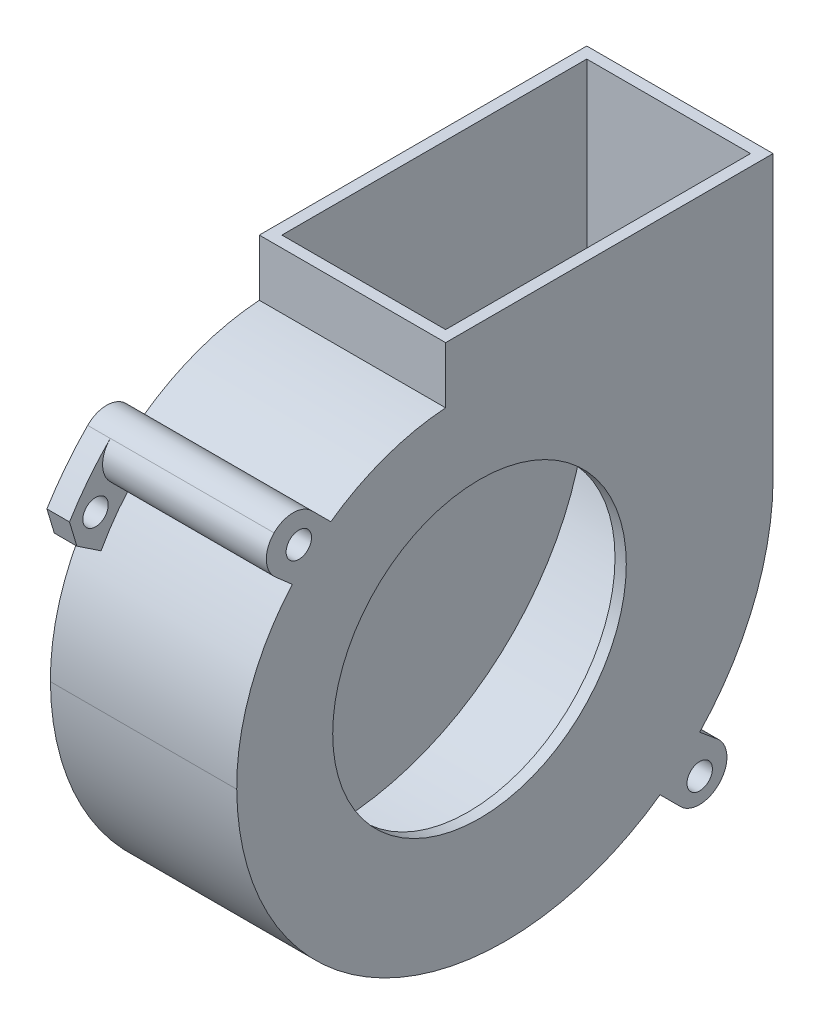
ISO-10303-21;
HEADER;
FILE_DESCRIPTION(('STEP AP214'),'2;1');
FILE_NAME('part.step','',(''),(''),'','','');
FILE_SCHEMA(('AUTOMOTIVE_DESIGN { 1 0 10303 214 1 1 1 1 }'));
ENDSEC;
DATA;
#1=APPLICATION_CONTEXT('core data for automotive mechanical design processes');
#2=APPLICATION_PROTOCOL_DEFINITION('international standard','automotive_design',2000,#1);
#3=PRODUCT_CONTEXT('',#1,'mechanical');
#4=PRODUCT('Part','Part','',(#3));
#5=PRODUCT_RELATED_PRODUCT_CATEGORY('part','',(#4));
#6=PRODUCT_DEFINITION_FORMATION('','',#4);
#7=PRODUCT_DEFINITION_CONTEXT('part definition',#1,'design');
#8=PRODUCT_DEFINITION('design','',#6,#7);
#9=PRODUCT_DEFINITION_SHAPE('','',#8);
#10=(LENGTH_UNIT() NAMED_UNIT(*) SI_UNIT(.MILLI.,.METRE.));
#11=(NAMED_UNIT(*) PLANE_ANGLE_UNIT() SI_UNIT($,.RADIAN.));
#12=(NAMED_UNIT(*) SI_UNIT($,.STERADIAN.) SOLID_ANGLE_UNIT());
#13=UNCERTAINTY_MEASURE_WITH_UNIT(LENGTH_MEASURE(1.E-05),#10,'distance_accuracy_value','');
#14=(GEOMETRIC_REPRESENTATION_CONTEXT(3) GLOBAL_UNCERTAINTY_ASSIGNED_CONTEXT((#13)) GLOBAL_UNIT_ASSIGNED_CONTEXT((#10,
#11,#12)) REPRESENTATION_CONTEXT('',''));
#15=CARTESIAN_POINT('',(0.,0.,0.));
#16=DIRECTION('',(0.,0.,1.));
#17=DIRECTION('',(1.,0.,0.));
#18=AXIS2_PLACEMENT_3D('',#15,#16,#17);
#19=CARTESIAN_POINT('',(33.,0.401698513800419,-4.49999999999999));
#20=DIRECTION('',(-1.,0.,0.));
#21=DIRECTION('',(0.,0.,1.));
#22=AXIS2_PLACEMENT_3D('',#19,#20,#21);
#23=CYLINDRICAL_SURFACE('',#22,47.5016985138004);
#24=DIRECTION('',(-1.,0.,0.));
#25=VECTOR('',#24,1.);
#26=CARTESIAN_POINT('',(33.,-32.2504279360342,-39.));
#27=LINE('',#26,#25);
#28=CARTESIAN_POINT('',(33.,-32.2504279360342,-39.));
#29=VERTEX_POINT('',#28);
#30=CARTESIAN_POINT('',(4.,-32.2504279360342,-39.));
#31=VERTEX_POINT('',#30);
#32=EDGE_CURVE('E249',#29,#31,#27,.T.);
#33=ORIENTED_EDGE('',*,*,#32,.T.);
#34=CARTESIAN_POINT('',(4.,0.401698513800419,-4.49999999999999));
#35=DIRECTION('',(-1.,0.,0.));
#36=DIRECTION('',(0.,0.,1.));
#37=AXIS2_PLACEMENT_3D('',#34,#35,#36);
#38=CIRCLE('',#37,47.5016985138004);
#39=CARTESIAN_POINT('',(4.,-25.2685357241009,-44.4681177423615));
#40=VERTEX_POINT('',#39);
#41=EDGE_CURVE('E259',#40,#31,#38,.T.);
#42=ORIENTED_EDGE('',*,*,#41,.F.);
#43=DIRECTION('',(-1.,0.,0.));
#44=VECTOR('',#43,1.);
#45=CARTESIAN_POINT('',(4.,-25.2685357241009,-44.4681177423615));
#46=LINE('',#45,#44);
#47=CARTESIAN_POINT('',(0.,-25.2685357241009,-44.4681177423615));
#48=VERTEX_POINT('',#47);
#49=EDGE_CURVE('E325',#40,#48,#46,.T.);
#50=ORIENTED_EDGE('',*,*,#49,.T.);
#51=CARTESIAN_POINT('',(0.,0.401698513800419,-4.49999999999999));
#52=DIRECTION('',(1.,0.,0.));
#53=DIRECTION('',(0.,0.,1.));
#54=AXIS2_PLACEMENT_3D('',#51,#52,#53);
#55=CIRCLE('',#54,47.5016985138004);
#56=CARTESIAN_POINT('',(0.,0.,-52.));
#57=VERTEX_POINT('',#56);
#58=EDGE_CURVE('E403',#48,#57,#55,.T.);
#59=ORIENTED_EDGE('',*,*,#58,.T.);
#60=DIRECTION('',(-1.,0.,0.));
#61=VECTOR('',#60,1.);
#62=CARTESIAN_POINT('',(33.,0.,-52.));
#63=LINE('',#62,#61);
#64=CARTESIAN_POINT('',(33.,0.,-52.));
#65=VERTEX_POINT('',#64);
#66=EDGE_CURVE('E455',#65,#57,#63,.T.);
#67=ORIENTED_EDGE('',*,*,#66,.F.);
#68=CARTESIAN_POINT('',(33.,0.401698513800419,-4.49999999999999));
#69=DIRECTION('',(1.,0.,0.));
#70=DIRECTION('',(0.,0.,1.));
#71=AXIS2_PLACEMENT_3D('',#68,#69,#70);
#72=CIRCLE('',#71,47.5016985138004);
#73=EDGE_CURVE('E271',#29,#65,#72,.T.);
#74=ORIENTED_EDGE('',*,*,#73,.F.);
#75=EDGE_LOOP('',(#33,#42,#50,#59,#67,#74));
#76=FACE_BOUND('',#75,.T.);
#77=ADVANCED_FACE('F50',(#76),#23,.T.);
#78=DIRECTION('',(-1.,0.,0.));
#79=VECTOR('',#78,1.);
#80=CARTESIAN_POINT('',(33.,-38.3442234179757,-31.9802637424152));
#81=LINE('',#80,#79);
#82=CARTESIAN_POINT('',(33.,-38.3442234179757,-31.9802637424152));
#83=VERTEX_POINT('',#82);
#84=CARTESIAN_POINT('',(0.,-38.3442234179757,-31.9802637424152));
#85=VERTEX_POINT('',#84);
#86=EDGE_CURVE('E274',#83,#85,#81,.T.);
#87=ORIENTED_EDGE('',*,*,#86,.F.);
#88=CARTESIAN_POINT('',(33.,0.,43.));
#89=VERTEX_POINT('',#88);
#90=EDGE_CURVE('E404',#89,#83,#72,.T.);
#91=ORIENTED_EDGE('',*,*,#90,.F.);
#92=DIRECTION('',(-1.,0.,0.));
#93=VECTOR('',#92,1.);
#94=CARTESIAN_POINT('',(33.,0.,43.));
#95=LINE('',#94,#93);
#96=CARTESIAN_POINT('',(0.,0.,43.));
#97=VERTEX_POINT('',#96);
#98=EDGE_CURVE('E422',#89,#97,#95,.T.);
#99=ORIENTED_EDGE('',*,*,#98,.T.);
#100=EDGE_CURVE('E423',#97,#85,#55,.T.);
#101=ORIENTED_EDGE('',*,*,#100,.T.);
#102=EDGE_LOOP('',(#87,#91,#99,#101));
#103=FACE_BOUND('',#102,.T.);
#104=ADVANCED_FACE('F645',(#103),#23,.T.);
#105=CARTESIAN_POINT('',(33.,0.336227008902246,3.2418670366511));
#106=DIRECTION('',(-1.,0.,0.));
#107=DIRECTION('',(0.,0.,1.));
#108=AXIS2_PLACEMENT_3D('',#105,#106,#107);
#109=CYLINDRICAL_SURFACE('',#108,39.7595546420335);
#110=DIRECTION('',(-1.,0.,0.));
#111=VECTOR('',#110,1.);
#112=CARTESIAN_POINT('',(33.,32.7006095169495,26.3366484862697));
#113=LINE('',#112,#111);
#114=CARTESIAN_POINT('',(33.,32.7006095169497,26.3366484862695));
#115=VERTEX_POINT('',#114);
#116=CARTESIAN_POINT('',(0.,32.7006095169497,26.3366484862695));
#117=VERTEX_POINT('',#116);
#118=EDGE_CURVE('E299',#115,#117,#113,.T.);
#119=ORIENTED_EDGE('',*,*,#118,.F.);
#120=CARTESIAN_POINT('',(33.,0.336227008902246,3.2418670366511));
#121=DIRECTION('',(1.,0.,0.));
#122=DIRECTION('',(0.,0.,1.));
#123=AXIS2_PLACEMENT_3D('',#120,#121,#122);
#124=CIRCLE('',#123,39.7595546420335);
#125=CARTESIAN_POINT('',(33.,40.,6.));
#126=VERTEX_POINT('',#125);
#127=EDGE_CURVE('E418',#126,#115,#124,.T.);
#128=ORIENTED_EDGE('',*,*,#127,.F.);
#129=DIRECTION('',(-1.,0.,0.));
#130=VECTOR('',#129,1.);
#131=CARTESIAN_POINT('',(33.,40.,6.));
#132=LINE('',#131,#130);
#133=CARTESIAN_POINT('',(0.,40.,6.));
#134=VERTEX_POINT('',#133);
#135=EDGE_CURVE('E443',#126,#134,#132,.T.);
#136=ORIENTED_EDGE('',*,*,#135,.T.);
#137=CARTESIAN_POINT('',(0.,0.336227008902246,3.2418670366511));
#138=DIRECTION('',(1.,0.,0.));
#139=DIRECTION('',(0.,0.,1.));
#140=AXIS2_PLACEMENT_3D('',#137,#138,#139);
#141=CIRCLE('',#140,39.7595546420335);
#142=EDGE_CURVE('E437',#134,#117,#141,.T.);
#143=ORIENTED_EDGE('',*,*,#142,.T.);
#144=EDGE_LOOP('',(#119,#128,#136,#143));
#145=FACE_BOUND('',#144,.T.);
#146=ADVANCED_FACE('F651',(#145),#109,.T.);
#147=DIRECTION('',(-1.,0.,0.));
#148=VECTOR('',#147,1.);
#149=CARTESIAN_POINT('',(33.,26.5124468861732,33.1689066207732));
#150=LINE('',#149,#148);
#151=CARTESIAN_POINT('',(33.,26.5124468861732,33.1689066207732));
#152=VERTEX_POINT('',#151);
#153=CARTESIAN_POINT('',(4.,26.5124468861732,33.1689066207732));
#154=VERTEX_POINT('',#153);
#155=EDGE_CURVE('E307',#152,#154,#150,.T.);
#156=ORIENTED_EDGE('',*,*,#155,.T.);
#157=CARTESIAN_POINT('',(4.,0.336227008902246,3.2418670366511));
#158=DIRECTION('',(-1.,0.,0.));
#159=DIRECTION('',(0.,0.,1.));
#160=AXIS2_PLACEMENT_3D('',#157,#158,#159);
#161=CIRCLE('',#160,39.7595546420335);
#162=CARTESIAN_POINT('',(4.,19.5852482227505,38.0311953952393));
#163=VERTEX_POINT('',#162);
#164=EDGE_CURVE('E343',#163,#154,#161,.T.);
#165=ORIENTED_EDGE('',*,*,#164,.F.);
#166=DIRECTION('',(-1.,0.,0.));
#167=VECTOR('',#166,1.);
#168=CARTESIAN_POINT('',(4.,19.5852482227505,38.0311953952393));
#169=LINE('',#168,#167);
#170=CARTESIAN_POINT('',(0.,19.5852482227505,38.0311953952393));
#171=VERTEX_POINT('',#170);
#172=EDGE_CURVE('E330',#163,#171,#169,.T.);
#173=ORIENTED_EDGE('',*,*,#172,.T.);
#174=EDGE_CURVE('E436',#171,#97,#141,.T.);
#175=ORIENTED_EDGE('',*,*,#174,.T.);
#176=ORIENTED_EDGE('',*,*,#98,.F.);
#177=EDGE_CURVE('E417',#152,#89,#124,.T.);
#178=ORIENTED_EDGE('',*,*,#177,.F.);
#179=EDGE_LOOP('',(#156,#165,#173,#175,#176,#178));
#180=FACE_BOUND('',#179,.T.);
#181=ADVANCED_FACE('F592',(#180),#109,.T.);
#182=CARTESIAN_POINT('',(4.,0.,0.));
#183=DIRECTION('',(-1.,0.,0.));
#184=DIRECTION('',(0.,0.,1.));
#185=AXIS2_PLACEMENT_3D('',#182,#183,#184);
#186=PLANE('',#185);
#187=CARTESIAN_POINT('',(4.,26.,39.));
#188=DIRECTION('',(-1.,0.,0.));
#189=DIRECTION('',(0.,0.,1.));
#190=AXIS2_PLACEMENT_3D('',#187,#188,#189);
#191=CIRCLE('',#190,2.25);
#192=CARTESIAN_POINT('',(4.,26.,41.25));
#193=VERTEX_POINT('',#192);
#194=EDGE_CURVE('E352',#193,#193,#191,.T.);
#195=ORIENTED_EDGE('',*,*,#194,.T.);
#196=EDGE_LOOP('',(#195));
#197=FACE_BOUND('',#196,.T.);
#198=DIRECTION('',(0.,-0.65836300514286,-0.752700573574421));
#199=VECTOR('',#198,1.);
#200=CARTESIAN_POINT('',(4.,-1.41601574265621,1.23854346920139));
#201=LINE('',#200,#199);
#202=CARTESIAN_POINT('',(4.,29.1065676427182,36.1347418304067));
#203=VERTEX_POINT('',#202);
#204=EDGE_CURVE('E255',#203,#154,#201,.T.);
#205=ORIENTED_EDGE('',*,*,#204,.F.);
#206=CARTESIAN_POINT('',(4.,32.6818953671967,33.0075175559781));
#207=DIRECTION('',(-1.,0.,0.));
#208=DIRECTION('',(0.,0.,1.));
#209=AXIS2_PLACEMENT_3D('',#206,#207,#208);
#210=CIRCLE('',#209,4.75);
#211=CARTESIAN_POINT('',(4.,36.0162183696367,36.3905325005799));
#212=VERTEX_POINT('',#211);
#213=EDGE_CURVE('E11',#203,#212,#210,.T.);
#214=ORIENTED_EDGE('',*,*,#213,.T.);
#215=CARTESIAN_POINT('',(4.,32.6678575696839,33.021410960276));
#216=DIRECTION('',(-1.,0.,0.));
#217=DIRECTION('',(0.,0.,1.));
#218=AXIS2_PLACEMENT_3D('',#215,#216,#217);
#219=CIRCLE('',#218,4.75);
#220=CARTESIAN_POINT('',(4.,36.0084888604477,36.3981967958259));
#221=VERTEX_POINT('',#220);
#222=EDGE_CURVE('E60',#212,#221,#219,.F.);
#223=ORIENTED_EDGE('',*,*,#222,.T.);
#224=CARTESIAN_POINT('',(4.,0.,0.));
#225=DIRECTION('',(-1.,0.,0.));
#226=DIRECTION('',(0.,0.,1.));
#227=AXIS2_PLACEMENT_3D('',#224,#225,#226);
#228=CIRCLE('',#227,51.2000000000064);
#229=CARTESIAN_POINT('',(4.,26.8102492942381,43.6193825355364));
#230=VERTEX_POINT('',#229);
#231=EDGE_CURVE('E339',#221,#230,#228,.F.);
#232=ORIENTED_EDGE('',*,*,#231,.T.);
#233=DIRECTION('',(0.,0.957876085319527,0.287181832943761));
#234=VECTOR('',#233,1.);
#235=CARTESIAN_POINT('',(4.,22.4365092610887,42.3080869527468));
#236=LINE('',#235,#234);
#237=CARTESIAN_POINT('',(4.,22.4365092610887,42.3080869527468));
#238=VERTEX_POINT('',#237);
#239=EDGE_CURVE('E256',#230,#238,#236,.F.);
#240=ORIENTED_EDGE('',*,*,#239,.T.);
#241=DIRECTION('',(0.,0.554700196225216,0.832050294337853));
#242=VECTOR('',#241,1.);
#243=CARTESIAN_POINT('',(4.,-3.99384141282111,2.66256094188065));
#244=LINE('',#243,#242);
#245=EDGE_CURVE('E348',#163,#238,#244,.T.);
#246=ORIENTED_EDGE('',*,*,#245,.F.);
#247=ORIENTED_EDGE('',*,*,#164,.T.);
#248=EDGE_LOOP('',(#205,#214,#223,#232,#240,#246,#247));
#249=FACE_BOUND('',#248,.T.);
#250=ADVANCED_FACE('F565',(#197,#249),#186,.F.);
#251=CARTESIAN_POINT('',(4.,0.,0.));
#252=DIRECTION('',(-1.,0.,0.));
#253=DIRECTION('',(0.,0.,1.));
#254=AXIS2_PLACEMENT_3D('',#251,#252,#253);
#255=PLANE('',#254);
#256=CARTESIAN_POINT('',(4.,-31.5,-45.));
#257=DIRECTION('',(-1.,0.,0.));
#258=DIRECTION('',(0.,0.,1.));
#259=AXIS2_PLACEMENT_3D('',#256,#257,#258);
#260=CIRCLE('',#259,2.25);
#261=CARTESIAN_POINT('',(4.,-31.5,-42.75));
#262=VERTEX_POINT('',#261);
#263=EDGE_CURVE('E321',#262,#262,#260,.T.);
#264=ORIENTED_EDGE('',*,*,#263,.T.);
#265=EDGE_LOOP('',(#264));
#266=FACE_BOUND('',#265,.T.);
#267=DIRECTION('',(0.,0.639323231191685,0.768938102878654));
#268=VECTOR('',#267,1.);
#269=CARTESIAN_POINT('',(4.,0.103824438897831,-0.0863234316316615));
#270=LINE('',#269,#268);
#271=CARTESIAN_POINT('',(4.,-34.8377339478056,-42.1118502804125));
#272=VERTEX_POINT('',#271);
#273=EDGE_CURVE('E244',#272,#31,#270,.T.);
#274=ORIENTED_EDGE('',*,*,#273,.F.);
#275=CARTESIAN_POINT('',(4.,-38.4901899364793,-39.075064932252));
#276=DIRECTION('',(-1.,0.,0.));
#277=DIRECTION('',(0.,0.,1.));
#278=AXIS2_PLACEMENT_3D('',#275,#276,#277);
#279=CIRCLE('',#278,4.75);
#280=CARTESIAN_POINT('',(4.,-41.8235259278129,-42.4590523980798));
#281=VERTEX_POINT('',#280);
#282=EDGE_CURVE('E560',#272,#281,#279,.T.);
#283=ORIENTED_EDGE('',*,*,#282,.T.);
#284=CARTESIAN_POINT('',(4.,0.,0.));
#285=DIRECTION('',(-1.,0.,0.));
#286=DIRECTION('',(0.,0.,1.));
#287=AXIS2_PLACEMENT_3D('',#284,#285,#286);
#288=CIRCLE('',#287,59.5984769233017);
#289=CARTESIAN_POINT('',(4.,-31.7635758624256,-50.4286991703064));
#290=VERTEX_POINT('',#289);
#291=EDGE_CURVE('E267',#281,#290,#288,.F.);
#292=ORIENTED_EDGE('',*,*,#291,.T.);
#293=CARTESIAN_POINT('',(4.,-30.6976568154237,-48.7364176968988));
#294=DIRECTION('',(-1.,0.,0.));
#295=DIRECTION('',(0.,0.,1.));
#296=AXIS2_PLACEMENT_3D('',#293,#294,#295);
#297=CIRCLE('',#296,2.);
#298=CARTESIAN_POINT('',(4.,-29.0591929743856,-49.8833423856254));
#299=VERTEX_POINT('',#298);
#300=EDGE_CURVE('E504',#290,#299,#297,.F.);
#301=ORIENTED_EDGE('',*,*,#300,.T.);
#302=DIRECTION('',(0.,0.573462344363328,0.819231920519041));
#303=VECTOR('',#302,1.);
#304=CARTESIAN_POINT('',(4.,3.93231321849135,-2.75261925294395));
#305=LINE('',#304,#303);
#306=EDGE_CURVE('E262',#299,#40,#305,.T.);
#307=ORIENTED_EDGE('',*,*,#306,.T.);
#308=ORIENTED_EDGE('',*,*,#41,.T.);
#309=EDGE_LOOP('',(#274,#283,#292,#301,#307,#308));
#310=FACE_BOUND('',#309,.T.);
#311=ADVANCED_FACE('F260',(#266,#310),#255,.F.);
#312=CARTESIAN_POINT('',(33.,0.,0.));
#313=DIRECTION('',(-1.,0.,0.));
#314=DIRECTION('',(0.,0.,1.));
#315=AXIS2_PLACEMENT_3D('',#312,#313,#314);
#316=CYLINDRICAL_SURFACE('',#315,26.);
#317=CARTESIAN_POINT('',(31.,0.,0.));
#318=DIRECTION('',(1.,0.,0.));
#319=DIRECTION('',(0.,0.,-1.));
#320=AXIS2_PLACEMENT_3D('',#317,#318,#319);
#321=CIRCLE('',#320,26.);
#322=CARTESIAN_POINT('',(31.,0.,-26.));
#323=VERTEX_POINT('',#322);
#324=EDGE_CURVE('E395',#323,#323,#321,.T.);
#325=ORIENTED_EDGE('',*,*,#324,.F.);
#326=EDGE_LOOP('',(#325));
#327=FACE_BOUND('',#326,.T.);
#328=CARTESIAN_POINT('',(33.,0.,0.));
#329=DIRECTION('',(1.,0.,0.));
#330=DIRECTION('',(0.,0.,-1.));
#331=AXIS2_PLACEMENT_3D('',#328,#329,#330);
#332=CIRCLE('',#331,26.);
#333=CARTESIAN_POINT('',(33.,0.,-26.));
#334=VERTEX_POINT('',#333);
#335=EDGE_CURVE('E399',#334,#334,#332,.T.);
#336=ORIENTED_EDGE('',*,*,#335,.T.);
#337=EDGE_LOOP('',(#336));
#338=FACE_BOUND('',#337,.T.);
#339=ADVANCED_FACE('F667',(#327,#338),#316,.F.);
#340=CARTESIAN_POINT('',(33.,0.401698513800419,-4.49999999999999));
#341=DIRECTION('',(-1.,0.,0.));
#342=DIRECTION('',(0.,0.,1.));
#343=AXIS2_PLACEMENT_3D('',#340,#341,#342);
#344=CYLINDRICAL_SURFACE('',#343,45.5016985138004);
#345=CARTESIAN_POINT('',(31.,0.401698513800419,-4.49999999999999));
#346=DIRECTION('',(-1.,0.,0.));
#347=DIRECTION('',(0.,0.,1.));
#348=AXIS2_PLACEMENT_3D('',#345,#346,#347);
#349=CIRCLE('',#348,45.5016985138004);
#350=CARTESIAN_POINT('',(31.,0.0169130168549075,41.0000715138133));
#351=VERTEX_POINT('',#350);
#352=CARTESIAN_POINT('',(31.,-2.99999999999988,-49.8743651731018));
#353=VERTEX_POINT('',#352);
#354=EDGE_CURVE('E459',#351,#353,#349,.F.);
#355=ORIENTED_EDGE('',*,*,#354,.T.);
#356=DIRECTION('',(-1.,0.,0.));
#357=VECTOR('',#356,1.);
#358=CARTESIAN_POINT('',(33.,-2.99999999999989,-49.8743651731018));
#359=LINE('',#358,#357);
#360=CARTESIAN_POINT('',(2.,-2.99999999999989,-49.8743651731018));
#361=VERTEX_POINT('',#360);
#362=EDGE_CURVE('E377',#353,#361,#359,.T.);
#363=ORIENTED_EDGE('',*,*,#362,.T.);
#364=CARTESIAN_POINT('',(2.,0.401698513800419,-4.49999999999999));
#365=DIRECTION('',(-1.,0.,0.));
#366=DIRECTION('',(0.,0.,1.));
#367=AXIS2_PLACEMENT_3D('',#364,#365,#366);
#368=CIRCLE('',#367,45.5016985138004);
#369=CARTESIAN_POINT('',(2.,0.0169130168549075,41.0000715138133));
#370=VERTEX_POINT('',#369);
#371=EDGE_CURVE('E478',#370,#361,#368,.F.);
#372=ORIENTED_EDGE('',*,*,#371,.F.);
#373=DIRECTION('',(-1.,0.,0.));
#374=VECTOR('',#373,1.);
#375=CARTESIAN_POINT('',(33.,0.0169130168549075,41.0000715138133));
#376=LINE('',#375,#374);
#377=EDGE_CURVE('E474',#351,#370,#376,.T.);
#378=ORIENTED_EDGE('',*,*,#377,.F.);
#379=EDGE_LOOP('',(#355,#363,#372,#378));
#380=FACE_BOUND('',#379,.T.);
#381=ADVANCED_FACE('F659',(#380),#344,.F.);
#382=CARTESIAN_POINT('',(31.,0.401698513800419,-4.49999999999999));
#383=DIRECTION('',(-1.,0.,0.));
#384=DIRECTION('',(0.,0.,1.));
#385=AXIS2_PLACEMENT_3D('',#382,#383,#384);
#386=PLANE('',#385);
#387=CARTESIAN_POINT('',(31.,0.336227008902246,3.2418670366511));
#388=DIRECTION('',(-1.,0.,0.));
#389=DIRECTION('',(0.,0.,1.));
#390=AXIS2_PLACEMENT_3D('',#387,#388,#389);
#391=CIRCLE('',#390,37.7595546420335);
#392=CARTESIAN_POINT('',(31.,38.0881700208135,4.));
#393=VERTEX_POINT('',#392);
#394=EDGE_CURVE('E482',#393,#351,#391,.F.);
#395=ORIENTED_EDGE('',*,*,#394,.F.);
#396=DIRECTION('',(0.,-1.,0.));
#397=VECTOR('',#396,1.);
#398=CARTESIAN_POINT('',(31.,0.401698513800419,4.));
#399=LINE('',#398,#397);
#400=CARTESIAN_POINT('',(31.,50.,4.));
#401=VERTEX_POINT('',#400);
#402=EDGE_CURVE('E485',#401,#393,#399,.T.);
#403=ORIENTED_EDGE('',*,*,#402,.F.);
#404=DIRECTION('',(0.,0.,-1.));
#405=VECTOR('',#404,1.);
#406=CARTESIAN_POINT('',(31.,50.,4.));
#407=LINE('',#406,#405);
#408=CARTESIAN_POINT('',(31.,50.0000000000001,-50.));
#409=VERTEX_POINT('',#408);
#410=EDGE_CURVE('E338',#401,#409,#407,.T.);
#411=ORIENTED_EDGE('',*,*,#410,.T.);
#412=DIRECTION('',(0.,1.,0.));
#413=VECTOR('',#412,1.);
#414=CARTESIAN_POINT('',(31.,0.401698513800419,-50.));
#415=LINE('',#414,#413);
#416=CARTESIAN_POINT('',(31.,-2.99999999999988,-50.0000000000001));
#417=VERTEX_POINT('',#416);
#418=EDGE_CURVE('E488',#417,#409,#415,.T.);
#419=ORIENTED_EDGE('',*,*,#418,.F.);
#420=DIRECTION('',(0.,0.,-1.));
#421=VECTOR('',#420,1.);
#422=CARTESIAN_POINT('',(31.,-3.00000000000001,3.99999999999988));
#423=LINE('',#422,#421);
#424=EDGE_CURVE('E365',#353,#417,#423,.T.);
#425=ORIENTED_EDGE('',*,*,#424,.F.);
#426=ORIENTED_EDGE('',*,*,#354,.F.);
#427=EDGE_LOOP('',(#395,#403,#411,#419,#425,#426));
#428=FACE_BOUND('',#427,.T.);
#429=ORIENTED_EDGE('',*,*,#324,.T.);
#430=EDGE_LOOP('',(#429));
#431=FACE_BOUND('',#430,.T.);
#432=ADVANCED_FACE('F655',(#428,#431),#386,.T.);
#433=CARTESIAN_POINT('',(2.,0.401698513800419,-4.49999999999999));
#434=DIRECTION('',(-1.,0.,0.));
#435=DIRECTION('',(0.,0.,1.));
#436=AXIS2_PLACEMENT_3D('',#433,#434,#435);
#437=PLANE('',#436);
#438=DIRECTION('',(0.,-1.,0.));
#439=VECTOR('',#438,1.);
#440=CARTESIAN_POINT('',(2.,0.401698513800419,4.));
#441=LINE('',#440,#439);
#442=CARTESIAN_POINT('',(2.,50.,4.));
#443=VERTEX_POINT('',#442);
#444=CARTESIAN_POINT('',(2.,38.0881700208135,4.));
#445=VERTEX_POINT('',#444);
#446=EDGE_CURVE('E468',#443,#445,#441,.T.);
#447=ORIENTED_EDGE('',*,*,#446,.T.);
#448=CARTESIAN_POINT('',(2.,0.336227008902246,3.2418670366511));
#449=DIRECTION('',(-1.,0.,0.));
#450=DIRECTION('',(0.,0.,1.));
#451=AXIS2_PLACEMENT_3D('',#448,#449,#450);
#452=CIRCLE('',#451,37.7595546420335);
#453=EDGE_CURVE('E465',#445,#370,#452,.F.);
#454=ORIENTED_EDGE('',*,*,#453,.T.);
#455=ORIENTED_EDGE('',*,*,#371,.T.);
#456=DIRECTION('',(0.,0.,1.));
#457=VECTOR('',#456,1.);
#458=CARTESIAN_POINT('',(2.,-3.00000000000001,3.99999999999988));
#459=LINE('',#458,#457);
#460=CARTESIAN_POINT('',(2.,-2.99999999999988,-50.0000000000001));
#461=VERTEX_POINT('',#460);
#462=EDGE_CURVE('E374',#461,#361,#459,.T.);
#463=ORIENTED_EDGE('',*,*,#462,.F.);
#464=DIRECTION('',(0.,1.,0.));
#465=VECTOR('',#464,1.);
#466=CARTESIAN_POINT('',(2.,0.401698513800419,-50.));
#467=LINE('',#466,#465);
#468=CARTESIAN_POINT('',(2.,50.0000000000001,-50.));
#469=VERTEX_POINT('',#468);
#470=EDGE_CURVE('E471',#461,#469,#467,.T.);
#471=ORIENTED_EDGE('',*,*,#470,.T.);
#472=DIRECTION('',(0.,0.,1.));
#473=VECTOR('',#472,1.);
#474=CARTESIAN_POINT('',(2.,50.,4.));
#475=LINE('',#474,#473);
#476=EDGE_CURVE('E385',#469,#443,#475,.T.);
#477=ORIENTED_EDGE('',*,*,#476,.T.);
#478=EDGE_LOOP('',(#447,#454,#455,#463,#471,#477));
#479=FACE_BOUND('',#478,.T.);
#480=ADVANCED_FACE('F658',(#479),#437,.F.);
#481=CARTESIAN_POINT('',(33.,0.,-50.));
#482=DIRECTION('',(0.,0.,1.));
#483=DIRECTION('',(1.,0.,0.));
#484=AXIS2_PLACEMENT_3D('',#481,#482,#483);
#485=PLANE('',#484);
#486=ORIENTED_EDGE('',*,*,#470,.F.);
#487=DIRECTION('',(-1.,0.,0.));
#488=VECTOR('',#487,1.);
#489=CARTESIAN_POINT('',(31.,-2.99999999999988,-50.0000000000001));
#490=LINE('',#489,#488);
#491=EDGE_CURVE('E369',#417,#461,#490,.T.);
#492=ORIENTED_EDGE('',*,*,#491,.F.);
#493=ORIENTED_EDGE('',*,*,#418,.T.);
#494=DIRECTION('',(-1.,0.,0.));
#495=VECTOR('',#494,1.);
#496=CARTESIAN_POINT('',(31.,50.0000000000001,-50.));
#497=LINE('',#496,#495);
#498=EDGE_CURVE('E381',#409,#469,#497,.T.);
#499=ORIENTED_EDGE('',*,*,#498,.T.);
#500=EDGE_LOOP('',(#486,#492,#493,#499));
#501=FACE_BOUND('',#500,.T.);
#502=ADVANCED_FACE('F663',(#501),#485,.T.);
#503=CARTESIAN_POINT('',(33.,50.,4.));
#504=DIRECTION('',(0.,0.,-1.));
#505=DIRECTION('',(-1.,0.,0.));
#506=AXIS2_PLACEMENT_3D('',#503,#504,#505);
#507=PLANE('',#506);
#508=ORIENTED_EDGE('',*,*,#446,.F.);
#509=DIRECTION('',(1.,0.,0.));
#510=VECTOR('',#509,1.);
#511=CARTESIAN_POINT('',(31.,50.,4.));
#512=LINE('',#511,#510);
#513=EDGE_CURVE('E370',#443,#401,#512,.T.);
#514=ORIENTED_EDGE('',*,*,#513,.T.);
#515=ORIENTED_EDGE('',*,*,#402,.T.);
#516=DIRECTION('',(-1.,0.,0.));
#517=VECTOR('',#516,1.);
#518=CARTESIAN_POINT('',(31.,38.0881700208135,4.));
#519=LINE('',#518,#517);
#520=EDGE_CURVE('E460',#393,#445,#519,.T.);
#521=ORIENTED_EDGE('',*,*,#520,.T.);
#522=EDGE_LOOP('',(#508,#514,#515,#521));
#523=FACE_BOUND('',#522,.T.);
#524=ADVANCED_FACE('F671',(#523),#507,.T.);
#525=CARTESIAN_POINT('',(33.,0.336227008902246,3.2418670366511));
#526=DIRECTION('',(-1.,0.,0.));
#527=DIRECTION('',(0.,0.,1.));
#528=AXIS2_PLACEMENT_3D('',#525,#526,#527);
#529=CYLINDRICAL_SURFACE('',#528,37.7595546420335);
#530=ORIENTED_EDGE('',*,*,#453,.F.);
#531=ORIENTED_EDGE('',*,*,#520,.F.);
#532=ORIENTED_EDGE('',*,*,#394,.T.);
#533=ORIENTED_EDGE('',*,*,#377,.T.);
#534=EDGE_LOOP('',(#530,#531,#532,#533));
#535=FACE_BOUND('',#534,.T.);
#536=ADVANCED_FACE('F675',(#535),#529,.F.);
#537=CARTESIAN_POINT('',(0.,-3.,0.));
#538=DIRECTION('',(0.,1.,0.));
#539=DIRECTION('',(0.,0.,1.));
#540=AXIS2_PLACEMENT_3D('',#537,#538,#539);
#541=PLANE('',#540);
#542=ORIENTED_EDGE('',*,*,#424,.T.);
#543=ORIENTED_EDGE('',*,*,#491,.T.);
#544=ORIENTED_EDGE('',*,*,#462,.T.);
#545=ORIENTED_EDGE('',*,*,#362,.F.);
#546=EDGE_LOOP('',(#542,#543,#544,#545));
#547=FACE_BOUND('',#546,.T.);
#548=ADVANCED_FACE('F640',(#547),#541,.T.);
#549=CARTESIAN_POINT('',(33.,0.401698513800419,-4.49999999999999));
#550=DIRECTION('',(-1.,0.,0.));
#551=DIRECTION('',(0.,0.,1.));
#552=AXIS2_PLACEMENT_3D('',#549,#550,#551);
#553=PLANE('',#552);
#554=CARTESIAN_POINT('',(33.,0.,0.));
#555=DIRECTION('',(-1.,0.,0.));
#556=DIRECTION('',(0.,0.,1.));
#557=AXIS2_PLACEMENT_3D('',#554,#555,#556);
#558=CIRCLE('',#557,59.5984769233017);
#559=CARTESIAN_POINT('',(33.,-41.9499162612442,-42.3341821375106));
#560=VERTEX_POINT('',#559);
#561=CARTESIAN_POINT('',(33.,-41.8235259278129,-42.4590523980798));
#562=VERTEX_POINT('',#561);
#563=EDGE_CURVE('E604',#560,#562,#558,.F.);
#564=ORIENTED_EDGE('',*,*,#563,.T.);
#565=CARTESIAN_POINT('',(33.,-38.4901899364793,-39.075064932252));
#566=DIRECTION('',(-1.,0.,0.));
#567=DIRECTION('',(0.,0.,1.));
#568=AXIS2_PLACEMENT_3D('',#565,#566,#567);
#569=CIRCLE('',#568,4.75);
#570=CARTESIAN_POINT('',(33.,-34.8377339478056,-42.1118502804125));
#571=VERTEX_POINT('',#570);
#572=EDGE_CURVE('E540',#562,#571,#569,.F.);
#573=ORIENTED_EDGE('',*,*,#572,.T.);
#574=DIRECTION('',(0.,0.639323231191685,0.768938102878654));
#575=VECTOR('',#574,1.);
#576=CARTESIAN_POINT('',(33.,0.103824438897831,-0.0863234316316615));
#577=LINE('',#576,#575);
#578=EDGE_CURVE('E611',#571,#29,#577,.T.);
#579=ORIENTED_EDGE('',*,*,#578,.T.);
#580=ORIENTED_EDGE('',*,*,#73,.T.);
#581=DIRECTION('',(0.,1.,0.));
#582=VECTOR('',#581,1.);
#583=CARTESIAN_POINT('',(33.,0.,-52.));
#584=LINE('',#583,#582);
#585=CARTESIAN_POINT('',(33.,50.,-52.));
#586=VERTEX_POINT('',#585);
#587=EDGE_CURVE('E408',#65,#586,#584,.T.);
#588=ORIENTED_EDGE('',*,*,#587,.T.);
#589=DIRECTION('',(0.,0.,1.));
#590=VECTOR('',#589,1.);
#591=CARTESIAN_POINT('',(33.,50.,-52.));
#592=LINE('',#591,#590);
#593=CARTESIAN_POINT('',(33.,50.,6.));
#594=VERTEX_POINT('',#593);
#595=EDGE_CURVE('E411',#586,#594,#592,.T.);
#596=ORIENTED_EDGE('',*,*,#595,.T.);
#597=DIRECTION('',(0.,-1.,0.));
#598=VECTOR('',#597,1.);
#599=CARTESIAN_POINT('',(33.,50.,6.));
#600=LINE('',#599,#598);
#601=EDGE_CURVE('E414',#594,#126,#600,.T.);
#602=ORIENTED_EDGE('',*,*,#601,.T.);
#603=ORIENTED_EDGE('',*,*,#127,.T.);
#604=DIRECTION('',(0.,0.707106781186546,0.707106781186549));
#605=VECTOR('',#604,1.);
#606=CARTESIAN_POINT('',(33.,3.18198051534014,-3.18198051534013));
#607=LINE('',#606,#605);
#608=CARTESIAN_POINT('',(33.,36.0266147803201,29.6626537496399));
#609=VERTEX_POINT('',#608);
#610=EDGE_CURVE('E287',#115,#609,#607,.T.);
#611=ORIENTED_EDGE('',*,*,#610,.T.);
#612=CARTESIAN_POINT('',(33.,32.6678575696839,33.021410960276));
#613=DIRECTION('',(-1.,0.,0.));
#614=DIRECTION('',(0.,0.,1.));
#615=AXIS2_PLACEMENT_3D('',#612,#613,#614);
#616=CIRCLE('',#615,4.75);
#617=CARTESIAN_POINT('',(33.,36.0162183696367,36.3905325005799));
#618=VERTEX_POINT('',#617);
#619=EDGE_CURVE('E534',#609,#618,#616,.F.);
#620=ORIENTED_EDGE('',*,*,#619,.T.);
#621=CARTESIAN_POINT('',(33.,32.6818953671967,33.0075175559781));
#622=DIRECTION('',(-1.,0.,0.));
#623=DIRECTION('',(0.,0.,1.));
#624=AXIS2_PLACEMENT_3D('',#621,#622,#623);
#625=CIRCLE('',#624,4.75);
#626=CARTESIAN_POINT('',(33.,29.1065676427182,36.1347418304067));
#627=VERTEX_POINT('',#626);
#628=EDGE_CURVE('E531',#618,#627,#625,.F.);
#629=ORIENTED_EDGE('',*,*,#628,.T.);
#630=DIRECTION('',(0.,-0.65836300514286,-0.752700573574421));
#631=VECTOR('',#630,1.);
#632=CARTESIAN_POINT('',(33.,-1.41601574265621,1.23854346920139));
#633=LINE('',#632,#631);
#634=EDGE_CURVE('E291',#627,#152,#633,.T.);
#635=ORIENTED_EDGE('',*,*,#634,.T.);
#636=ORIENTED_EDGE('',*,*,#177,.T.);
#637=ORIENTED_EDGE('',*,*,#90,.T.);
#638=DIRECTION('',(0.,-0.707098469182781,-0.707115093092608));
#639=VECTOR('',#638,1.);
#640=CARTESIAN_POINT('',(33.,-3.18243057391993,3.18235575662441));
#641=LINE('',#640,#639);
#642=CARTESIAN_POINT('',(33.,-41.9653036495799,-35.6014291057427));
#643=VERTEX_POINT('',#642);
#644=EDGE_CURVE('E607',#83,#643,#641,.T.);
#645=ORIENTED_EDGE('',*,*,#644,.T.);
#646=CARTESIAN_POINT('',(33.,-38.60650695739,-38.9601468343609));
#647=DIRECTION('',(-1.,0.,0.));
#648=DIRECTION('',(0.,0.,1.));
#649=AXIS2_PLACEMENT_3D('',#646,#647,#648);
#650=CIRCLE('',#649,4.75);
#651=EDGE_CURVE('E537',#643,#560,#650,.F.);
#652=ORIENTED_EDGE('',*,*,#651,.T.);
#653=EDGE_LOOP('',(#564,#573,#579,#580,#588,#596,#602,#603,#611,#620,#629,#635,#636,#637,#645,#652));
#654=FACE_BOUND('',#653,.T.);
#655=ORIENTED_EDGE('',*,*,#335,.F.);
#656=EDGE_LOOP('',(#655));
#657=FACE_BOUND('',#656,.T.);
#658=CARTESIAN_POINT('',(33.,32.,32.));
#659=DIRECTION('',(-1.,0.,0.));
#660=DIRECTION('',(0.,0.,1.));
#661=AXIS2_PLACEMENT_3D('',#658,#659,#660);
#662=CIRCLE('',#661,2.25);
#663=CARTESIAN_POINT('',(33.,32.,34.25));
#664=VERTEX_POINT('',#663);
#665=EDGE_CURVE('E295',#664,#664,#662,.T.);
#666=ORIENTED_EDGE('',*,*,#665,.T.);
#667=EDGE_LOOP('',(#666));
#668=FACE_BOUND('',#667,.T.);
#669=CARTESIAN_POINT('',(33.,-39.,-39.));
#670=DIRECTION('',(-1.,0.,0.));
#671=DIRECTION('',(0.,0.,1.));
#672=AXIS2_PLACEMENT_3D('',#669,#670,#671);
#673=CIRCLE('',#672,2.25);
#674=CARTESIAN_POINT('',(33.,-39.,-36.75));
#675=VERTEX_POINT('',#674);
#676=EDGE_CURVE('E281',#675,#675,#673,.T.);
#677=ORIENTED_EDGE('',*,*,#676,.T.);
#678=EDGE_LOOP('',(#677));
#679=FACE_BOUND('',#678,.T.);
#680=ADVANCED_FACE('F619',(#654,#657,#668,#679),#553,.F.);
#681=CARTESIAN_POINT('',(0.,0.401698513800419,-4.49999999999999));
#682=DIRECTION('',(-1.,0.,0.));
#683=DIRECTION('',(0.,0.,1.));
#684=AXIS2_PLACEMENT_3D('',#681,#682,#683);
#685=PLANE('',#684);
#686=CARTESIAN_POINT('',(0.,0.,0.));
#687=DIRECTION('',(-1.,0.,0.));
#688=DIRECTION('',(0.,0.,1.));
#689=AXIS2_PLACEMENT_3D('',#686,#687,#688);
#690=CIRCLE('',#689,59.5984769233017);
#691=CARTESIAN_POINT('',(0.,-41.9499162612442,-42.3341821375106));
#692=VERTEX_POINT('',#691);
#693=CARTESIAN_POINT('',(0.,-31.7635758624256,-50.4286991703064));
#694=VERTEX_POINT('',#693);
#695=EDGE_CURVE('E326',#692,#694,#690,.F.);
#696=ORIENTED_EDGE('',*,*,#695,.F.);
#697=CARTESIAN_POINT('',(0.,-38.60650695739,-38.9601468343609));
#698=DIRECTION('',(-1.,0.,0.));
#699=DIRECTION('',(0.,0.,1.));
#700=AXIS2_PLACEMENT_3D('',#697,#698,#699);
#701=CIRCLE('',#700,4.75);
#702=CARTESIAN_POINT('',(0.,-41.9653036495799,-35.6014291057427));
#703=VERTEX_POINT('',#702);
#704=EDGE_CURVE('E546',#692,#703,#701,.T.);
#705=ORIENTED_EDGE('',*,*,#704,.T.);
#706=DIRECTION('',(0.,-0.707098469182781,-0.707115093092608));
#707=VECTOR('',#706,1.);
#708=CARTESIAN_POINT('',(0.,-3.18243057391993,3.18235575662441));
#709=LINE('',#708,#707);
#710=EDGE_CURVE('E311',#85,#703,#709,.T.);
#711=ORIENTED_EDGE('',*,*,#710,.F.);
#712=ORIENTED_EDGE('',*,*,#100,.F.);
#713=ORIENTED_EDGE('',*,*,#174,.F.);
#714=DIRECTION('',(0.,0.554700196225216,0.832050294337853));
#715=VECTOR('',#714,1.);
#716=CARTESIAN_POINT('',(0.,-3.99384141282111,2.66256094188065));
#717=LINE('',#716,#715);
#718=CARTESIAN_POINT('',(0.,22.4365092610887,42.3080869527468));
#719=VERTEX_POINT('',#718);
#720=EDGE_CURVE('E278',#171,#719,#717,.T.);
#721=ORIENTED_EDGE('',*,*,#720,.T.);
#722=DIRECTION('',(0.,-0.957876085319527,-0.287181832943761));
#723=VECTOR('',#722,1.);
#724=CARTESIAN_POINT('',(0.,-10.6571999517958,32.3862273131529));
#725=LINE('',#724,#723);
#726=CARTESIAN_POINT('',(0.,26.8102492942381,43.6193825355364));
#727=VERTEX_POINT('',#726);
#728=EDGE_CURVE('E511',#719,#727,#725,.F.);
#729=ORIENTED_EDGE('',*,*,#728,.T.);
#730=CARTESIAN_POINT('',(0.,0.,0.));
#731=DIRECTION('',(-1.,0.,0.));
#732=DIRECTION('',(0.,0.,1.));
#733=AXIS2_PLACEMENT_3D('',#730,#731,#732);
#734=CIRCLE('',#733,51.2000000000064);
#735=CARTESIAN_POINT('',(0.,36.0084888604477,36.3981967958259));
#736=VERTEX_POINT('',#735);
#737=EDGE_CURVE('E273',#736,#727,#734,.F.);
#738=ORIENTED_EDGE('',*,*,#737,.F.);
#739=CARTESIAN_POINT('',(0.,32.6678575696839,33.021410960276));
#740=DIRECTION('',(-1.,0.,0.));
#741=DIRECTION('',(0.,0.,1.));
#742=AXIS2_PLACEMENT_3D('',#739,#740,#741);
#743=CIRCLE('',#742,4.75);
#744=CARTESIAN_POINT('',(0.,36.0266147803201,29.6626537496399));
#745=VERTEX_POINT('',#744);
#746=EDGE_CURVE('E543',#736,#745,#743,.T.);
#747=ORIENTED_EDGE('',*,*,#746,.T.);
#748=DIRECTION('',(0.,0.707106781186546,0.707106781186549));
#749=VECTOR('',#748,1.);
#750=CARTESIAN_POINT('',(0.,3.18198051534014,-3.18198051534013));
#751=LINE('',#750,#749);
#752=EDGE_CURVE('E300',#117,#745,#751,.T.);
#753=ORIENTED_EDGE('',*,*,#752,.F.);
#754=ORIENTED_EDGE('',*,*,#142,.F.);
#755=DIRECTION('',(0.,-1.,0.));
#756=VECTOR('',#755,1.);
#757=CARTESIAN_POINT('',(0.,50.,6.));
#758=LINE('',#757,#756);
#759=CARTESIAN_POINT('',(0.,50.,6.));
#760=VERTEX_POINT('',#759);
#761=EDGE_CURVE('E433',#760,#134,#758,.T.);
#762=ORIENTED_EDGE('',*,*,#761,.F.);
#763=DIRECTION('',(0.,0.,1.));
#764=VECTOR('',#763,1.);
#765=CARTESIAN_POINT('',(0.,50.,0.));
#766=LINE('',#765,#764);
#767=CARTESIAN_POINT('',(0.,50.,-52.));
#768=VERTEX_POINT('',#767);
#769=EDGE_CURVE('E430',#768,#760,#766,.T.);
#770=ORIENTED_EDGE('',*,*,#769,.F.);
#771=DIRECTION('',(0.,1.,0.));
#772=VECTOR('',#771,1.);
#773=CARTESIAN_POINT('',(0.,0.,-52.));
#774=LINE('',#773,#772);
#775=EDGE_CURVE('E426',#57,#768,#774,.T.);
#776=ORIENTED_EDGE('',*,*,#775,.F.);
#777=ORIENTED_EDGE('',*,*,#58,.F.);
#778=DIRECTION('',(0.,0.573462344363328,0.819231920519041));
#779=VECTOR('',#778,1.);
#780=CARTESIAN_POINT('',(0.,3.93231321849135,-2.75261925294395));
#781=LINE('',#780,#779);
#782=CARTESIAN_POINT('',(0.,-29.0591929743856,-49.8833423856254));
#783=VERTEX_POINT('',#782);
#784=EDGE_CURVE('E329',#783,#48,#781,.T.);
#785=ORIENTED_EDGE('',*,*,#784,.F.);
#786=CARTESIAN_POINT('',(0.,-30.6976568154237,-48.7364176968988));
#787=DIRECTION('',(-1.,0.,0.));
#788=DIRECTION('',(0.,0.,1.));
#789=AXIS2_PLACEMENT_3D('',#786,#787,#788);
#790=CIRCLE('',#789,2.);
#791=EDGE_CURVE('E497',#783,#694,#790,.T.);
#792=ORIENTED_EDGE('',*,*,#791,.T.);
#793=EDGE_LOOP('',(#696,#705,#711,#712,#713,#721,#729,#738,#747,#753,#754,#762,#770,#776,#777,
#785,#792));
#794=FACE_BOUND('',#793,.T.);
#795=CARTESIAN_POINT('',(0.,32.,32.));
#796=DIRECTION('',(-1.,0.,0.));
#797=DIRECTION('',(0.,0.,1.));
#798=AXIS2_PLACEMENT_3D('',#795,#796,#797);
#799=CIRCLE('',#798,2.25);
#800=CARTESIAN_POINT('',(0.,32.,34.25));
#801=VERTEX_POINT('',#800);
#802=EDGE_CURVE('E292',#801,#801,#799,.T.);
#803=ORIENTED_EDGE('',*,*,#802,.F.);
#804=EDGE_LOOP('',(#803));
#805=FACE_BOUND('',#804,.T.);
#806=CARTESIAN_POINT('',(0.,26.,39.));
#807=DIRECTION('',(-1.,0.,0.));
#808=DIRECTION('',(0.,0.,1.));
#809=AXIS2_PLACEMENT_3D('',#806,#807,#808);
#810=CIRCLE('',#809,2.25);
#811=CARTESIAN_POINT('',(0.,26.,41.25));
#812=VERTEX_POINT('',#811);
#813=EDGE_CURVE('E344',#812,#812,#810,.T.);
#814=ORIENTED_EDGE('',*,*,#813,.F.);
#815=EDGE_LOOP('',(#814));
#816=FACE_BOUND('',#815,.T.);
#817=CARTESIAN_POINT('',(0.,-31.5,-45.));
#818=DIRECTION('',(-1.,0.,0.));
#819=DIRECTION('',(0.,0.,1.));
#820=AXIS2_PLACEMENT_3D('',#817,#818,#819);
#821=CIRCLE('',#820,2.25);
#822=CARTESIAN_POINT('',(0.,-31.5,-42.75));
#823=VERTEX_POINT('',#822);
#824=EDGE_CURVE('E317',#823,#823,#821,.T.);
#825=ORIENTED_EDGE('',*,*,#824,.F.);
#826=EDGE_LOOP('',(#825));
#827=FACE_BOUND('',#826,.T.);
#828=CARTESIAN_POINT('',(0.,-39.,-39.));
#829=DIRECTION('',(-1.,0.,0.));
#830=DIRECTION('',(0.,0.,1.));
#831=AXIS2_PLACEMENT_3D('',#828,#829,#830);
#832=CIRCLE('',#831,2.25);
#833=CARTESIAN_POINT('',(0.,-39.,-36.75));
#834=VERTEX_POINT('',#833);
#835=EDGE_CURVE('E284',#834,#834,#832,.T.);
#836=ORIENTED_EDGE('',*,*,#835,.F.);
#837=EDGE_LOOP('',(#836));
#838=FACE_BOUND('',#837,.T.);
#839=ADVANCED_FACE('F579',(#794,#805,#816,#827,#838),#685,.T.);
#840=CARTESIAN_POINT('',(33.,0.,-52.));
#841=DIRECTION('',(0.,0.,1.));
#842=DIRECTION('',(1.,0.,0.));
#843=AXIS2_PLACEMENT_3D('',#840,#841,#842);
#844=PLANE('',#843);
#845=ORIENTED_EDGE('',*,*,#775,.T.);
#846=DIRECTION('',(-1.,0.,0.));
#847=VECTOR('',#846,1.);
#848=CARTESIAN_POINT('',(33.,50.,-52.));
#849=LINE('',#848,#847);
#850=EDGE_CURVE('E451',#586,#768,#849,.T.);
#851=ORIENTED_EDGE('',*,*,#850,.F.);
#852=ORIENTED_EDGE('',*,*,#587,.F.);
#853=ORIENTED_EDGE('',*,*,#66,.T.);
#854=EDGE_LOOP('',(#845,#851,#852,#853));
#855=FACE_BOUND('',#854,.T.);
#856=ADVANCED_FACE('F630',(#855),#844,.F.);
#857=CARTESIAN_POINT('',(33.,50.,0.));
#858=DIRECTION('',(0.,-1.,0.));
#859=DIRECTION('',(0.,0.,-1.));
#860=AXIS2_PLACEMENT_3D('',#857,#858,#859);
#861=PLANE('',#860);
#862=ORIENTED_EDGE('',*,*,#498,.F.);
#863=ORIENTED_EDGE('',*,*,#410,.F.);
#864=ORIENTED_EDGE('',*,*,#513,.F.);
#865=ORIENTED_EDGE('',*,*,#476,.F.);
#866=EDGE_LOOP('',(#862,#863,#864,#865));
#867=FACE_BOUND('',#866,.T.);
#868=ORIENTED_EDGE('',*,*,#769,.T.);
#869=DIRECTION('',(-1.,0.,0.));
#870=VECTOR('',#869,1.);
#871=CARTESIAN_POINT('',(33.,50.,6.));
#872=LINE('',#871,#870);
#873=EDGE_CURVE('E447',#594,#760,#872,.T.);
#874=ORIENTED_EDGE('',*,*,#873,.F.);
#875=ORIENTED_EDGE('',*,*,#595,.F.);
#876=ORIENTED_EDGE('',*,*,#850,.T.);
#877=EDGE_LOOP('',(#868,#874,#875,#876));
#878=FACE_BOUND('',#877,.T.);
#879=ADVANCED_FACE('F637',(#867,#878),#861,.F.);
#880=CARTESIAN_POINT('',(33.,50.,6.));
#881=DIRECTION('',(0.,0.,-1.));
#882=DIRECTION('',(-1.,0.,0.));
#883=AXIS2_PLACEMENT_3D('',#880,#881,#882);
#884=PLANE('',#883);
#885=ORIENTED_EDGE('',*,*,#761,.T.);
#886=ORIENTED_EDGE('',*,*,#135,.F.);
#887=ORIENTED_EDGE('',*,*,#601,.F.);
#888=ORIENTED_EDGE('',*,*,#873,.T.);
#889=EDGE_LOOP('',(#885,#886,#887,#888));
#890=FACE_BOUND('',#889,.T.);
#891=ADVANCED_FACE('F762',(#890),#884,.F.);
#892=CARTESIAN_POINT('',(4.,0.,0.));
#893=DIRECTION('',(-1.,0.,0.));
#894=DIRECTION('',(0.,0.,1.));
#895=AXIS2_PLACEMENT_3D('',#892,#893,#894);
#896=CYLINDRICAL_SURFACE('',#895,51.2000000000064);
#897=ORIENTED_EDGE('',*,*,#231,.F.);
#898=DIRECTION('',(-1.,0.,0.));
#899=VECTOR('',#898,1.);
#900=CARTESIAN_POINT('',(4.,36.0084888604477,36.3981967958259));
#901=LINE('',#900,#899);
#902=EDGE_CURVE('E552',#221,#736,#901,.T.);
#903=ORIENTED_EDGE('',*,*,#902,.T.);
#904=ORIENTED_EDGE('',*,*,#737,.T.);
#905=DIRECTION('',(-1.,0.,0.));
#906=VECTOR('',#905,1.);
#907=CARTESIAN_POINT('',(4.,26.8102492942381,43.6193825355364));
#908=LINE('',#907,#906);
#909=EDGE_CURVE('E515',#727,#230,#908,.F.);
#910=ORIENTED_EDGE('',*,*,#909,.T.);
#911=EDGE_LOOP('',(#897,#903,#904,#910));
#912=FACE_BOUND('',#911,.T.);
#913=ADVANCED_FACE('F576',(#912),#896,.T.);
#914=CARTESIAN_POINT('',(4.,-3.99384141282111,2.66256094188065));
#915=DIRECTION('',(0.,-0.832050294337853,0.554700196225216));
#916=DIRECTION('',(0.,-0.554700196225216,-0.832050294337853));
#917=AXIS2_PLACEMENT_3D('',#914,#915,#916);
#918=PLANE('',#917);
#919=ORIENTED_EDGE('',*,*,#245,.T.);
#920=DIRECTION('',(-1.,0.,0.));
#921=VECTOR('',#920,1.);
#922=CARTESIAN_POINT('',(0.,22.4365092610887,42.3080869527468));
#923=LINE('',#922,#921);
#924=EDGE_CURVE('E507',#238,#719,#923,.T.);
#925=ORIENTED_EDGE('',*,*,#924,.T.);
#926=ORIENTED_EDGE('',*,*,#720,.F.);
#927=ORIENTED_EDGE('',*,*,#172,.F.);
#928=EDGE_LOOP('',(#919,#925,#926,#927));
#929=FACE_BOUND('',#928,.T.);
#930=ADVANCED_FACE('F590',(#929),#918,.T.);
#931=CARTESIAN_POINT('',(4.,26.,39.));
#932=DIRECTION('',(-1.,0.,0.));
#933=DIRECTION('',(0.,0.,1.));
#934=AXIS2_PLACEMENT_3D('',#931,#932,#933);
#935=CYLINDRICAL_SURFACE('',#934,2.25);
#936=ORIENTED_EDGE('',*,*,#194,.F.);
#937=EDGE_LOOP('',(#936));
#938=FACE_BOUND('',#937,.T.);
#939=ORIENTED_EDGE('',*,*,#813,.T.);
#940=EDGE_LOOP('',(#939));
#941=FACE_BOUND('',#940,.T.);
#942=ADVANCED_FACE('F754',(#938,#941),#935,.F.);
#943=CARTESIAN_POINT('',(4.,0.,0.));
#944=DIRECTION('',(-1.,0.,0.));
#945=DIRECTION('',(0.,0.,1.));
#946=AXIS2_PLACEMENT_3D('',#943,#944,#945);
#947=CYLINDRICAL_SURFACE('',#946,59.5984769233017);
#948=ORIENTED_EDGE('',*,*,#291,.F.);
#949=DIRECTION('',(-1.,0.,0.));
#950=VECTOR('',#949,1.);
#951=CARTESIAN_POINT('',(4.,-41.8235259278129,-42.4590523980798));
#952=LINE('',#951,#950);
#953=EDGE_CURVE('E528',#281,#562,#952,.F.);
#954=ORIENTED_EDGE('',*,*,#953,.T.);
#955=ORIENTED_EDGE('',*,*,#563,.F.);
#956=DIRECTION('',(-1.,0.,0.));
#957=VECTOR('',#956,1.);
#958=CARTESIAN_POINT('',(4.,-41.9499162612442,-42.3341821375106));
#959=LINE('',#958,#957);
#960=EDGE_CURVE('E524',#560,#692,#959,.T.);
#961=ORIENTED_EDGE('',*,*,#960,.T.);
#962=ORIENTED_EDGE('',*,*,#695,.T.);
#963=DIRECTION('',(-1.,0.,0.));
#964=VECTOR('',#963,1.);
#965=CARTESIAN_POINT('',(4.,-31.7635758624256,-50.4286991703064));
#966=LINE('',#965,#964);
#967=EDGE_CURVE('E501',#694,#290,#966,.F.);
#968=ORIENTED_EDGE('',*,*,#967,.T.);
#969=EDGE_LOOP('',(#948,#954,#955,#961,#962,#968));
#970=FACE_BOUND('',#969,.T.);
#971=ADVANCED_FACE('F751',(#970),#947,.T.);
#972=CARTESIAN_POINT('',(4.,3.93231321849135,-2.75261925294395));
#973=DIRECTION('',(0.,-0.819231920519041,0.573462344363328));
#974=DIRECTION('',(0.,-0.573462344363328,-0.819231920519041));
#975=AXIS2_PLACEMENT_3D('',#972,#973,#974);
#976=PLANE('',#975);
#977=ORIENTED_EDGE('',*,*,#306,.F.);
#978=DIRECTION('',(-1.,0.,0.));
#979=VECTOR('',#978,1.);
#980=CARTESIAN_POINT('',(4.,-29.0591929743856,-49.8833423856254));
#981=LINE('',#980,#979);
#982=EDGE_CURVE('E464',#299,#783,#981,.T.);
#983=ORIENTED_EDGE('',*,*,#982,.T.);
#984=ORIENTED_EDGE('',*,*,#784,.T.);
#985=ORIENTED_EDGE('',*,*,#49,.F.);
#986=EDGE_LOOP('',(#977,#983,#984,#985));
#987=FACE_BOUND('',#986,.T.);
#988=ADVANCED_FACE('F753',(#987),#976,.F.);
#989=CARTESIAN_POINT('',(4.,-31.5,-45.));
#990=DIRECTION('',(-1.,0.,0.));
#991=DIRECTION('',(0.,0.,1.));
#992=AXIS2_PLACEMENT_3D('',#989,#990,#991);
#993=CYLINDRICAL_SURFACE('',#992,2.25);
#994=ORIENTED_EDGE('',*,*,#263,.F.);
#995=EDGE_LOOP('',(#994));
#996=FACE_BOUND('',#995,.T.);
#997=ORIENTED_EDGE('',*,*,#824,.T.);
#998=EDGE_LOOP('',(#997));
#999=FACE_BOUND('',#998,.T.);
#1000=ADVANCED_FACE('F683',(#996,#999),#993,.F.);
#1001=CARTESIAN_POINT('',(4.,-30.6976568154237,-48.7364176968988));
#1002=DIRECTION('',(-1.,0.,0.));
#1003=DIRECTION('',(0.,0.,1.));
#1004=AXIS2_PLACEMENT_3D('',#1001,#1002,#1003);
#1005=CYLINDRICAL_SURFACE('',#1004,2.);
#1006=ORIENTED_EDGE('',*,*,#300,.F.);
#1007=ORIENTED_EDGE('',*,*,#967,.F.);
#1008=ORIENTED_EDGE('',*,*,#791,.F.);
#1009=ORIENTED_EDGE('',*,*,#982,.F.);
#1010=EDGE_LOOP('',(#1006,#1007,#1008,#1009));
#1011=FACE_BOUND('',#1010,.T.);
#1012=ADVANCED_FACE('F680',(#1011),#1005,.T.);
#1013=CARTESIAN_POINT('',(4.,22.4365092610887,42.3080869527468));
#1014=DIRECTION('',(0.,0.287181832943761,-0.957876085319527));
#1015=DIRECTION('',(-1.,0.,0.));
#1016=AXIS2_PLACEMENT_3D('',#1013,#1014,#1015);
#1017=PLANE('',#1016);
#1018=ORIENTED_EDGE('',*,*,#239,.F.);
#1019=ORIENTED_EDGE('',*,*,#909,.F.);
#1020=ORIENTED_EDGE('',*,*,#728,.F.);
#1021=ORIENTED_EDGE('',*,*,#924,.F.);
#1022=EDGE_LOOP('',(#1018,#1019,#1020,#1021));
#1023=FACE_BOUND('',#1022,.T.);
#1024=ADVANCED_FACE('F586',(#1023),#1017,.F.);
#1025=CARTESIAN_POINT('',(33.,0.103824438897831,-0.0863234316316615));
#1026=DIRECTION('',(0.,-0.768938102878654,0.639323231191685));
#1027=DIRECTION('',(0.,-0.639323231191685,-0.768938102878654));
#1028=AXIS2_PLACEMENT_3D('',#1025,#1026,#1027);
#1029=PLANE('',#1028);
#1030=ORIENTED_EDGE('',*,*,#578,.F.);
#1031=DIRECTION('',(-1.,0.,0.));
#1032=VECTOR('',#1031,1.);
#1033=CARTESIAN_POINT('',(33.,-34.8377339478056,-42.1118502804125));
#1034=LINE('',#1033,#1032);
#1035=EDGE_CURVE('E251',#571,#272,#1034,.T.);
#1036=ORIENTED_EDGE('',*,*,#1035,.T.);
#1037=ORIENTED_EDGE('',*,*,#273,.T.);
#1038=ORIENTED_EDGE('',*,*,#32,.F.);
#1039=EDGE_LOOP('',(#1030,#1036,#1037,#1038));
#1040=FACE_BOUND('',#1039,.T.);
#1041=ADVANCED_FACE('F247',(#1040),#1029,.F.);
#1042=CARTESIAN_POINT('',(33.,-3.18243057391993,3.18235575662441));
#1043=DIRECTION('',(0.,0.707115093092608,-0.707098469182781));
#1044=DIRECTION('',(0.,0.707098469182781,0.707115093092608));
#1045=AXIS2_PLACEMENT_3D('',#1042,#1043,#1044);
#1046=PLANE('',#1045);
#1047=ORIENTED_EDGE('',*,*,#710,.T.);
#1048=DIRECTION('',(-1.,0.,0.));
#1049=VECTOR('',#1048,1.);
#1050=CARTESIAN_POINT('',(33.,-41.9653036495799,-35.6014291057427));
#1051=LINE('',#1050,#1049);
#1052=EDGE_CURVE('E549',#703,#643,#1051,.F.);
#1053=ORIENTED_EDGE('',*,*,#1052,.T.);
#1054=ORIENTED_EDGE('',*,*,#644,.F.);
#1055=ORIENTED_EDGE('',*,*,#86,.T.);
#1056=EDGE_LOOP('',(#1047,#1053,#1054,#1055));
#1057=FACE_BOUND('',#1056,.T.);
#1058=ADVANCED_FACE('F625',(#1057),#1046,.F.);
#1059=CARTESIAN_POINT('',(33.,-39.,-39.));
#1060=DIRECTION('',(-1.,0.,0.));
#1061=DIRECTION('',(0.,0.,1.));
#1062=AXIS2_PLACEMENT_3D('',#1059,#1060,#1061);
#1063=CYLINDRICAL_SURFACE('',#1062,2.25);
#1064=ORIENTED_EDGE('',*,*,#676,.F.);
#1065=EDGE_LOOP('',(#1064));
#1066=FACE_BOUND('',#1065,.T.);
#1067=ORIENTED_EDGE('',*,*,#835,.T.);
#1068=EDGE_LOOP('',(#1067));
#1069=FACE_BOUND('',#1068,.T.);
#1070=ADVANCED_FACE('F621',(#1066,#1069),#1063,.F.);
#1071=CARTESIAN_POINT('',(33.,-1.41601574265621,1.23854346920139));
#1072=DIRECTION('',(0.,0.752700573574421,-0.65836300514286));
#1073=DIRECTION('',(0.,0.65836300514286,0.752700573574421));
#1074=AXIS2_PLACEMENT_3D('',#1071,#1072,#1073);
#1075=PLANE('',#1074);
#1076=ORIENTED_EDGE('',*,*,#634,.F.);
#1077=DIRECTION('',(-1.,0.,0.));
#1078=VECTOR('',#1077,1.);
#1079=CARTESIAN_POINT('',(33.,29.1065676427182,36.1347418304067));
#1080=LINE('',#1079,#1078);
#1081=EDGE_CURVE('E73',#627,#203,#1080,.T.);
#1082=ORIENTED_EDGE('',*,*,#1081,.T.);
#1083=ORIENTED_EDGE('',*,*,#204,.T.);
#1084=ORIENTED_EDGE('',*,*,#155,.F.);
#1085=EDGE_LOOP('',(#1076,#1082,#1083,#1084));
#1086=FACE_BOUND('',#1085,.T.);
#1087=ADVANCED_FACE('F624',(#1086),#1075,.F.);
#1088=CARTESIAN_POINT('',(33.,3.18198051534014,-3.18198051534013));
#1089=DIRECTION('',(0.,-0.707106781186549,0.707106781186546));
#1090=DIRECTION('',(0.,-0.707106781186546,-0.707106781186549));
#1091=AXIS2_PLACEMENT_3D('',#1088,#1089,#1090);
#1092=PLANE('',#1091);
#1093=ORIENTED_EDGE('',*,*,#752,.T.);
#1094=DIRECTION('',(-1.,0.,0.));
#1095=VECTOR('',#1094,1.);
#1096=CARTESIAN_POINT('',(33.,36.0266147803201,29.6626537496399));
#1097=LINE('',#1096,#1095);
#1098=EDGE_CURVE('E555',#745,#609,#1097,.F.);
#1099=ORIENTED_EDGE('',*,*,#1098,.T.);
#1100=ORIENTED_EDGE('',*,*,#610,.F.);
#1101=ORIENTED_EDGE('',*,*,#118,.T.);
#1102=EDGE_LOOP('',(#1093,#1099,#1100,#1101));
#1103=FACE_BOUND('',#1102,.T.);
#1104=ADVANCED_FACE('F718',(#1103),#1092,.F.);
#1105=CARTESIAN_POINT('',(33.,32.,32.));
#1106=DIRECTION('',(-1.,0.,0.));
#1107=DIRECTION('',(0.,0.,1.));
#1108=AXIS2_PLACEMENT_3D('',#1105,#1106,#1107);
#1109=CYLINDRICAL_SURFACE('',#1108,2.25);
#1110=ORIENTED_EDGE('',*,*,#665,.F.);
#1111=EDGE_LOOP('',(#1110));
#1112=FACE_BOUND('',#1111,.T.);
#1113=ORIENTED_EDGE('',*,*,#802,.T.);
#1114=EDGE_LOOP('',(#1113));
#1115=FACE_BOUND('',#1114,.T.);
#1116=ADVANCED_FACE('F693',(#1112,#1115),#1109,.F.);
#1117=CARTESIAN_POINT('',(4.,-38.4901899364793,-39.075064932252));
#1118=DIRECTION('',(-1.,0.,0.));
#1119=DIRECTION('',(0.,0.,1.));
#1120=AXIS2_PLACEMENT_3D('',#1117,#1118,#1119);
#1121=CYLINDRICAL_SURFACE('',#1120,4.75);
#1122=ORIENTED_EDGE('',*,*,#572,.F.);
#1123=ORIENTED_EDGE('',*,*,#953,.F.);
#1124=ORIENTED_EDGE('',*,*,#282,.F.);
#1125=ORIENTED_EDGE('',*,*,#1035,.F.);
#1126=EDGE_LOOP('',(#1122,#1123,#1124,#1125));
#1127=FACE_BOUND('',#1126,.T.);
#1128=ADVANCED_FACE('F689',(#1127),#1121,.T.);
#1129=CARTESIAN_POINT('',(4.,-38.60650695739,-38.9601468343609));
#1130=DIRECTION('',(-1.,0.,0.));
#1131=DIRECTION('',(0.,0.,1.));
#1132=AXIS2_PLACEMENT_3D('',#1129,#1130,#1131);
#1133=CYLINDRICAL_SURFACE('',#1132,4.75);
#1134=ORIENTED_EDGE('',*,*,#651,.F.);
#1135=ORIENTED_EDGE('',*,*,#1052,.F.);
#1136=ORIENTED_EDGE('',*,*,#704,.F.);
#1137=ORIENTED_EDGE('',*,*,#960,.F.);
#1138=EDGE_LOOP('',(#1134,#1135,#1136,#1137));
#1139=FACE_BOUND('',#1138,.T.);
#1140=ADVANCED_FACE('F692',(#1139),#1133,.T.);
#1141=CARTESIAN_POINT('',(4.,32.6818953671967,33.0075175559781));
#1142=DIRECTION('',(-1.,0.,0.));
#1143=DIRECTION('',(0.,0.,1.));
#1144=AXIS2_PLACEMENT_3D('',#1141,#1142,#1143);
#1145=CYLINDRICAL_SURFACE('',#1144,4.75);
#1146=ORIENTED_EDGE('',*,*,#1081,.F.);
#1147=ORIENTED_EDGE('',*,*,#628,.F.);
#1148=DIRECTION('',(-1.,0.,0.));
#1149=VECTOR('',#1148,1.);
#1150=CARTESIAN_POINT('',(18.5,36.0162183696367,36.3905325005799));
#1151=LINE('',#1150,#1149);
#1152=EDGE_CURVE('E54',#212,#618,#1151,.F.);
#1153=ORIENTED_EDGE('',*,*,#1152,.F.);
#1154=ORIENTED_EDGE('',*,*,#213,.F.);
#1155=EDGE_LOOP('',(#1146,#1147,#1153,#1154));
#1156=FACE_BOUND('',#1155,.T.);
#1157=ADVANCED_FACE('F52',(#1156),#1145,.T.);
#1158=CARTESIAN_POINT('',(4.,32.6678575696839,33.021410960276));
#1159=DIRECTION('',(-1.,0.,0.));
#1160=DIRECTION('',(0.,0.,1.));
#1161=AXIS2_PLACEMENT_3D('',#1158,#1159,#1160);
#1162=CYLINDRICAL_SURFACE('',#1161,4.75);
#1163=ORIENTED_EDGE('',*,*,#619,.F.);
#1164=ORIENTED_EDGE('',*,*,#1098,.F.);
#1165=ORIENTED_EDGE('',*,*,#746,.F.);
#1166=ORIENTED_EDGE('',*,*,#902,.F.);
#1167=ORIENTED_EDGE('',*,*,#222,.F.);
#1168=ORIENTED_EDGE('',*,*,#1152,.T.);
#1169=EDGE_LOOP('',(#1163,#1164,#1165,#1166,#1167,#1168));
#1170=FACE_BOUND('',#1169,.T.);
#1171=ADVANCED_FACE('F571',(#1170),#1162,.T.);
#1172=CLOSED_SHELL('',(#77,#104,#146,#181,#250,#311,#339,#381,#432,#480,#502,#524,#536,#548,
#680,#839,#856,#879,#891,#913,#930,#942,#971,#988,#1000,#1012,#1024,#1041,#1058,#1070,#1087,
#1104,#1116,#1128,#1140,#1157,#1171));
#1173=MANIFOLD_SOLID_BREP('B2',#1172);
#1174=ADVANCED_BREP_SHAPE_REPRESENTATION('',(#18,#1173),#14);
#1175=SHAPE_DEFINITION_REPRESENTATION(#9,#1174);
ENDSEC;
END-ISO-10303-21;
